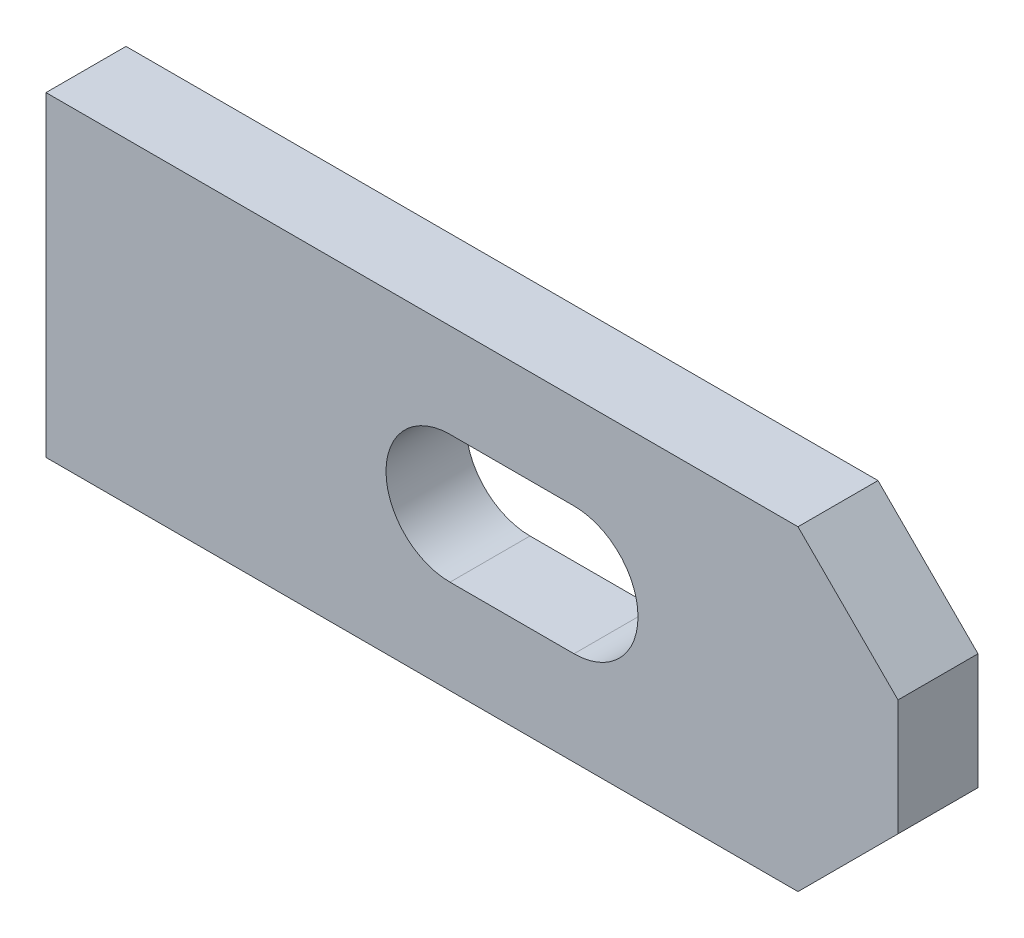
ISO-10303-21;
HEADER;
FILE_DESCRIPTION(('STEP AP214'),'2;1');
FILE_NAME('part.step','',(''),(''),'','','');
FILE_SCHEMA(('AUTOMOTIVE_DESIGN { 1 0 10303 214 1 1 1 1 }'));
ENDSEC;
DATA;
#1=APPLICATION_CONTEXT('core data for automotive mechanical design processes');
#2=APPLICATION_PROTOCOL_DEFINITION('international standard','automotive_design',2000,#1);
#3=PRODUCT_CONTEXT('',#1,'mechanical');
#4=PRODUCT('Part','Part','',(#3));
#5=PRODUCT_RELATED_PRODUCT_CATEGORY('part','',(#4));
#6=PRODUCT_DEFINITION_FORMATION('','',#4);
#7=PRODUCT_DEFINITION_CONTEXT('part definition',#1,'design');
#8=PRODUCT_DEFINITION('design','',#6,#7);
#9=PRODUCT_DEFINITION_SHAPE('','',#8);
#10=(LENGTH_UNIT() NAMED_UNIT(*) SI_UNIT(.MILLI.,.METRE.));
#11=(NAMED_UNIT(*) PLANE_ANGLE_UNIT() SI_UNIT($,.RADIAN.));
#12=(NAMED_UNIT(*) SI_UNIT($,.STERADIAN.) SOLID_ANGLE_UNIT());
#13=UNCERTAINTY_MEASURE_WITH_UNIT(LENGTH_MEASURE(1.E-05),#10,'distance_accuracy_value','');
#14=(GEOMETRIC_REPRESENTATION_CONTEXT(3) GLOBAL_UNCERTAINTY_ASSIGNED_CONTEXT((#13)) GLOBAL_UNIT_ASSIGNED_CONTEXT((#10,
#11,#12)) REPRESENTATION_CONTEXT('',''));
#15=CARTESIAN_POINT('',(0.,0.,0.));
#16=DIRECTION('',(0.,0.,1.));
#17=DIRECTION('',(1.,0.,0.));
#18=AXIS2_PLACEMENT_3D('',#15,#16,#17);
#19=CARTESIAN_POINT('',(0.,1.0033,0.254));
#20=DIRECTION('',(1.,0.,0.));
#21=DIRECTION('',(0.,0.,-1.));
#22=AXIS2_PLACEMENT_3D('',#19,#20,#21);
#23=PLANE('',#22);
#24=DIRECTION('',(0.,-1.,0.));
#25=VECTOR('',#24,1.);
#26=CARTESIAN_POINT('',(0.,1.0033,-0.254));
#27=LINE('',#26,#25);
#28=CARTESIAN_POINT('',(0.,1.0033,-0.254));
#29=VERTEX_POINT('',#28);
#30=CARTESIAN_POINT('',(0.,-1.0033,-0.254));
#31=VERTEX_POINT('',#30);
#32=EDGE_CURVE('E11',#29,#31,#27,.T.);
#33=ORIENTED_EDGE('',*,*,#32,.T.);
#34=DIRECTION('',(0.,0.,-1.));
#35=VECTOR('',#34,1.);
#36=CARTESIAN_POINT('',(0.,-1.0033,0.254));
#37=LINE('',#36,#35);
#38=CARTESIAN_POINT('',(0.,-1.0033,0.254));
#39=VERTEX_POINT('',#38);
#40=EDGE_CURVE('E25',#39,#31,#37,.T.);
#41=ORIENTED_EDGE('',*,*,#40,.F.);
#42=DIRECTION('',(0.,-1.,0.));
#43=VECTOR('',#42,1.);
#44=CARTESIAN_POINT('',(0.,1.0033,0.254));
#45=LINE('',#44,#43);
#46=CARTESIAN_POINT('',(0.,1.0033,0.254));
#47=VERTEX_POINT('',#46);
#48=EDGE_CURVE('E224',#47,#39,#45,.T.);
#49=ORIENTED_EDGE('',*,*,#48,.F.);
#50=DIRECTION('',(0.,0.,-1.));
#51=VECTOR('',#50,1.);
#52=CARTESIAN_POINT('',(0.,1.0033,0.254));
#53=LINE('',#52,#51);
#54=EDGE_CURVE('E220',#47,#29,#53,.T.);
#55=ORIENTED_EDGE('',*,*,#54,.T.);
#56=EDGE_LOOP('',(#33,#41,#49,#55));
#57=FACE_BOUND('',#56,.T.);
#58=ADVANCED_FACE('F17',(#57),#23,.F.);
#59=CARTESIAN_POINT('',(4.7752,1.0033,0.254));
#60=DIRECTION('',(0.,-1.,0.));
#61=DIRECTION('',(0.,0.,-1.));
#62=AXIS2_PLACEMENT_3D('',#59,#60,#61);
#63=PLANE('',#62);
#64=DIRECTION('',(-1.,0.,0.));
#65=VECTOR('',#64,1.);
#66=CARTESIAN_POINT('',(4.7752,1.0033,-0.254));
#67=LINE('',#66,#65);
#68=CARTESIAN_POINT('',(4.7752,1.0033,-0.254));
#69=VERTEX_POINT('',#68);
#70=EDGE_CURVE('E215',#69,#29,#67,.T.);
#71=ORIENTED_EDGE('',*,*,#70,.T.);
#72=ORIENTED_EDGE('',*,*,#54,.F.);
#73=DIRECTION('',(-1.,0.,0.));
#74=VECTOR('',#73,1.);
#75=CARTESIAN_POINT('',(4.7752,1.0033,0.254));
#76=LINE('',#75,#74);
#77=CARTESIAN_POINT('',(4.7752,1.0033,0.254));
#78=VERTEX_POINT('',#77);
#79=EDGE_CURVE('E210',#78,#47,#76,.T.);
#80=ORIENTED_EDGE('',*,*,#79,.F.);
#81=DIRECTION('',(0.,0.,-1.));
#82=VECTOR('',#81,1.);
#83=CARTESIAN_POINT('',(4.7752,1.0033,0.254));
#84=LINE('',#83,#82);
#85=EDGE_CURVE('E206',#78,#69,#84,.T.);
#86=ORIENTED_EDGE('',*,*,#85,.T.);
#87=EDGE_LOOP('',(#71,#72,#80,#86));
#88=FACE_BOUND('',#87,.T.);
#89=ADVANCED_FACE('F242',(#88),#63,.F.);
#90=CARTESIAN_POINT('',(5.4102,0.3683,0.254));
#91=DIRECTION('',(-0.707106781186548,-0.707106781186548,0.));
#92=DIRECTION('',(0.707106781186548,-0.707106781186548,0.));
#93=AXIS2_PLACEMENT_3D('',#90,#91,#92);
#94=PLANE('',#93);
#95=DIRECTION('',(-0.707106781186548,0.707106781186548,0.));
#96=VECTOR('',#95,1.);
#97=CARTESIAN_POINT('',(5.4102,0.3683,-0.254));
#98=LINE('',#97,#96);
#99=CARTESIAN_POINT('',(5.4102,0.3683,-0.254));
#100=VERTEX_POINT('',#99);
#101=EDGE_CURVE('E201',#100,#69,#98,.T.);
#102=ORIENTED_EDGE('',*,*,#101,.T.);
#103=ORIENTED_EDGE('',*,*,#85,.F.);
#104=DIRECTION('',(-0.707106781186548,0.707106781186548,0.));
#105=VECTOR('',#104,1.);
#106=CARTESIAN_POINT('',(5.4102,0.3683,0.254));
#107=LINE('',#106,#105);
#108=CARTESIAN_POINT('',(5.4102,0.3683,0.254));
#109=VERTEX_POINT('',#108);
#110=EDGE_CURVE('E196',#109,#78,#107,.T.);
#111=ORIENTED_EDGE('',*,*,#110,.F.);
#112=DIRECTION('',(0.,0.,-1.));
#113=VECTOR('',#112,1.);
#114=CARTESIAN_POINT('',(5.4102,0.3683,0.254));
#115=LINE('',#114,#113);
#116=EDGE_CURVE('E192',#109,#100,#115,.T.);
#117=ORIENTED_EDGE('',*,*,#116,.T.);
#118=EDGE_LOOP('',(#102,#103,#111,#117));
#119=FACE_BOUND('',#118,.T.);
#120=ADVANCED_FACE('F253',(#119),#94,.F.);
#121=CARTESIAN_POINT('',(5.4102,-0.3683,0.254));
#122=DIRECTION('',(-1.,0.,0.));
#123=DIRECTION('',(0.,0.,1.));
#124=AXIS2_PLACEMENT_3D('',#121,#122,#123);
#125=PLANE('',#124);
#126=DIRECTION('',(0.,1.,0.));
#127=VECTOR('',#126,1.);
#128=CARTESIAN_POINT('',(5.4102,-0.3683,-0.254));
#129=LINE('',#128,#127);
#130=CARTESIAN_POINT('',(5.4102,-0.3683,-0.254));
#131=VERTEX_POINT('',#130);
#132=EDGE_CURVE('E187',#131,#100,#129,.T.);
#133=ORIENTED_EDGE('',*,*,#132,.T.);
#134=ORIENTED_EDGE('',*,*,#116,.F.);
#135=DIRECTION('',(0.,1.,0.));
#136=VECTOR('',#135,1.);
#137=CARTESIAN_POINT('',(5.4102,-0.3683,0.254));
#138=LINE('',#137,#136);
#139=CARTESIAN_POINT('',(5.4102,-0.3683,0.254));
#140=VERTEX_POINT('',#139);
#141=EDGE_CURVE('E182',#140,#109,#138,.T.);
#142=ORIENTED_EDGE('',*,*,#141,.F.);
#143=DIRECTION('',(0.,0.,-1.));
#144=VECTOR('',#143,1.);
#145=CARTESIAN_POINT('',(5.4102,-0.3683,0.254));
#146=LINE('',#145,#144);
#147=EDGE_CURVE('E178',#140,#131,#146,.T.);
#148=ORIENTED_EDGE('',*,*,#147,.T.);
#149=EDGE_LOOP('',(#133,#134,#142,#148));
#150=FACE_BOUND('',#149,.T.);
#151=ADVANCED_FACE('F251',(#150),#125,.F.);
#152=CARTESIAN_POINT('',(4.7752,-1.0033,0.254));
#153=DIRECTION('',(-0.707106781186548,0.707106781186548,0.));
#154=DIRECTION('',(-0.707106781186548,-0.707106781186548,0.));
#155=AXIS2_PLACEMENT_3D('',#152,#153,#154);
#156=PLANE('',#155);
#157=DIRECTION('',(0.707106781186548,0.707106781186548,0.));
#158=VECTOR('',#157,1.);
#159=CARTESIAN_POINT('',(4.7752,-1.0033,-0.254));
#160=LINE('',#159,#158);
#161=CARTESIAN_POINT('',(4.7752,-1.0033,-0.254));
#162=VERTEX_POINT('',#161);
#163=EDGE_CURVE('E173',#162,#131,#160,.T.);
#164=ORIENTED_EDGE('',*,*,#163,.T.);
#165=ORIENTED_EDGE('',*,*,#147,.F.);
#166=DIRECTION('',(0.707106781186548,0.707106781186548,0.));
#167=VECTOR('',#166,1.);
#168=CARTESIAN_POINT('',(4.7752,-1.0033,0.254));
#169=LINE('',#168,#167);
#170=CARTESIAN_POINT('',(4.7752,-1.0033,0.254));
#171=VERTEX_POINT('',#170);
#172=EDGE_CURVE('E168',#171,#140,#169,.T.);
#173=ORIENTED_EDGE('',*,*,#172,.F.);
#174=DIRECTION('',(0.,0.,-1.));
#175=VECTOR('',#174,1.);
#176=CARTESIAN_POINT('',(4.7752,-1.0033,0.254));
#177=LINE('',#176,#175);
#178=EDGE_CURVE('E164',#171,#162,#177,.T.);
#179=ORIENTED_EDGE('',*,*,#178,.T.);
#180=EDGE_LOOP('',(#164,#165,#173,#179));
#181=FACE_BOUND('',#180,.T.);
#182=ADVANCED_FACE('F248',(#181),#156,.F.);
#183=CARTESIAN_POINT('',(0.,-1.0033,0.254));
#184=DIRECTION('',(0.,1.,0.));
#185=DIRECTION('',(0.,0.,1.));
#186=AXIS2_PLACEMENT_3D('',#183,#184,#185);
#187=PLANE('',#186);
#188=DIRECTION('',(1.,0.,0.));
#189=VECTOR('',#188,1.);
#190=CARTESIAN_POINT('',(0.,-1.0033,-0.254));
#191=LINE('',#190,#189);
#192=EDGE_CURVE('E159',#31,#162,#191,.T.);
#193=ORIENTED_EDGE('',*,*,#192,.T.);
#194=ORIENTED_EDGE('',*,*,#178,.F.);
#195=DIRECTION('',(1.,0.,0.));
#196=VECTOR('',#195,1.);
#197=CARTESIAN_POINT('',(0.,-1.0033,0.254));
#198=LINE('',#197,#196);
#199=EDGE_CURVE('E154',#39,#171,#198,.T.);
#200=ORIENTED_EDGE('',*,*,#199,.F.);
#201=ORIENTED_EDGE('',*,*,#40,.T.);
#202=EDGE_LOOP('',(#193,#194,#200,#201));
#203=FACE_BOUND('',#202,.T.);
#204=ADVANCED_FACE('F234',(#203),#187,.F.);
#205=CARTESIAN_POINT('',(0.,0.,0.254));
#206=DIRECTION('',(0.,0.,1.));
#207=DIRECTION('',(1.,0.,0.));
#208=AXIS2_PLACEMENT_3D('',#205,#206,#207);
#209=PLANE('',#208);
#210=DIRECTION('',(-1.,0.,0.));
#211=VECTOR('',#210,1.);
#212=CARTESIAN_POINT('',(3.3528,0.4064,0.254));
#213=LINE('',#212,#211);
#214=CARTESIAN_POINT('',(3.3528,0.4064,0.254));
#215=VERTEX_POINT('',#214);
#216=CARTESIAN_POINT('',(2.5654,0.4064,0.254));
#217=VERTEX_POINT('',#216);
#218=EDGE_CURVE('E150',#215,#217,#213,.T.);
#219=ORIENTED_EDGE('',*,*,#218,.F.);
#220=CARTESIAN_POINT('',(3.3528,0.,0.254));
#221=DIRECTION('',(0.,0.,1.));
#222=DIRECTION('',(1.,0.,0.));
#223=AXIS2_PLACEMENT_3D('',#220,#221,#222);
#224=CIRCLE('',#223,0.4064);
#225=CARTESIAN_POINT('',(3.3528,-0.4064,0.254));
#226=VERTEX_POINT('',#225);
#227=EDGE_CURVE('E98',#226,#215,#224,.T.);
#228=ORIENTED_EDGE('',*,*,#227,.F.);
#229=DIRECTION('',(1.,0.,0.));
#230=VECTOR('',#229,1.);
#231=CARTESIAN_POINT('',(2.5654,-0.4064,0.254));
#232=LINE('',#231,#230);
#233=CARTESIAN_POINT('',(2.5654,-0.4064,0.254));
#234=VERTEX_POINT('',#233);
#235=EDGE_CURVE('E142',#234,#226,#232,.T.);
#236=ORIENTED_EDGE('',*,*,#235,.F.);
#237=CARTESIAN_POINT('',(2.5654,0.,0.254));
#238=DIRECTION('',(0.,0.,1.));
#239=DIRECTION('',(1.,0.,0.));
#240=AXIS2_PLACEMENT_3D('',#237,#238,#239);
#241=CIRCLE('',#240,0.4064);
#242=EDGE_CURVE('E137',#217,#234,#241,.T.);
#243=ORIENTED_EDGE('',*,*,#242,.F.);
#244=EDGE_LOOP('',(#219,#228,#236,#243));
#245=FACE_BOUND('',#244,.T.);
#246=ORIENTED_EDGE('',*,*,#48,.T.);
#247=ORIENTED_EDGE('',*,*,#199,.T.);
#248=ORIENTED_EDGE('',*,*,#172,.T.);
#249=ORIENTED_EDGE('',*,*,#141,.T.);
#250=ORIENTED_EDGE('',*,*,#110,.T.);
#251=ORIENTED_EDGE('',*,*,#79,.T.);
#252=EDGE_LOOP('',(#246,#247,#248,#249,#250,#251));
#253=FACE_BOUND('',#252,.T.);
#254=ADVANCED_FACE('F238',(#245,#253),#209,.T.);
#255=CARTESIAN_POINT('',(2.5654,0.,0.254));
#256=DIRECTION('',(0.,0.,-1.));
#257=DIRECTION('',(1.,0.,0.));
#258=AXIS2_PLACEMENT_3D('',#255,#256,#257);
#259=CYLINDRICAL_SURFACE('',#258,0.4064);
#260=CARTESIAN_POINT('',(2.5654,0.,-0.254));
#261=DIRECTION('',(0.,0.,1.));
#262=DIRECTION('',(1.,0.,0.));
#263=AXIS2_PLACEMENT_3D('',#260,#261,#262);
#264=CIRCLE('',#263,0.4064);
#265=CARTESIAN_POINT('',(2.5654,0.4064,-0.254));
#266=VERTEX_POINT('',#265);
#267=CARTESIAN_POINT('',(2.5654,-0.4064,-0.254));
#268=VERTEX_POINT('',#267);
#269=EDGE_CURVE('E133',#266,#268,#264,.T.);
#270=ORIENTED_EDGE('',*,*,#269,.F.);
#271=DIRECTION('',(0.,0.,-1.));
#272=VECTOR('',#271,1.);
#273=CARTESIAN_POINT('',(2.5654,0.4064,0.254));
#274=LINE('',#273,#272);
#275=EDGE_CURVE('E107',#217,#266,#274,.T.);
#276=ORIENTED_EDGE('',*,*,#275,.F.);
#277=ORIENTED_EDGE('',*,*,#242,.T.);
#278=DIRECTION('',(0.,0.,-1.));
#279=VECTOR('',#278,1.);
#280=CARTESIAN_POINT('',(2.5654,-0.4064,0.254));
#281=LINE('',#280,#279);
#282=EDGE_CURVE('E126',#234,#268,#281,.T.);
#283=ORIENTED_EDGE('',*,*,#282,.T.);
#284=EDGE_LOOP('',(#270,#276,#277,#283));
#285=FACE_BOUND('',#284,.T.);
#286=ADVANCED_FACE('F314',(#285),#259,.F.);
#287=CARTESIAN_POINT('',(2.5654,-0.4064,0.254));
#288=DIRECTION('',(0.,1.,0.));
#289=DIRECTION('',(0.,0.,1.));
#290=AXIS2_PLACEMENT_3D('',#287,#288,#289);
#291=PLANE('',#290);
#292=DIRECTION('',(1.,0.,0.));
#293=VECTOR('',#292,1.);
#294=CARTESIAN_POINT('',(2.5654,-0.4064,-0.254));
#295=LINE('',#294,#293);
#296=CARTESIAN_POINT('',(3.3528,-0.4064,-0.254));
#297=VERTEX_POINT('',#296);
#298=EDGE_CURVE('E114',#268,#297,#295,.T.);
#299=ORIENTED_EDGE('',*,*,#298,.F.);
#300=ORIENTED_EDGE('',*,*,#282,.F.);
#301=ORIENTED_EDGE('',*,*,#235,.T.);
#302=DIRECTION('',(0.,0.,-1.));
#303=VECTOR('',#302,1.);
#304=CARTESIAN_POINT('',(3.3528,-0.4064,0.254));
#305=LINE('',#304,#303);
#306=EDGE_CURVE('E115',#226,#297,#305,.T.);
#307=ORIENTED_EDGE('',*,*,#306,.T.);
#308=EDGE_LOOP('',(#299,#300,#301,#307));
#309=FACE_BOUND('',#308,.T.);
#310=ADVANCED_FACE('F325',(#309),#291,.T.);
#311=CARTESIAN_POINT('',(3.3528,0.,0.254));
#312=DIRECTION('',(0.,0.,-1.));
#313=DIRECTION('',(-1.,0.,0.));
#314=AXIS2_PLACEMENT_3D('',#311,#312,#313);
#315=CYLINDRICAL_SURFACE('',#314,0.4064);
#316=CARTESIAN_POINT('',(3.3528,0.,-0.254));
#317=DIRECTION('',(0.,0.,1.));
#318=DIRECTION('',(1.,0.,0.));
#319=AXIS2_PLACEMENT_3D('',#316,#317,#318);
#320=CIRCLE('',#319,0.4064);
#321=CARTESIAN_POINT('',(3.3528,0.4064,-0.254));
#322=VERTEX_POINT('',#321);
#323=EDGE_CURVE('E96',#297,#322,#320,.T.);
#324=ORIENTED_EDGE('',*,*,#323,.F.);
#325=ORIENTED_EDGE('',*,*,#306,.F.);
#326=ORIENTED_EDGE('',*,*,#227,.T.);
#327=DIRECTION('',(0.,0.,-1.));
#328=VECTOR('',#327,1.);
#329=CARTESIAN_POINT('',(3.3528,0.4064,0.254));
#330=LINE('',#329,#328);
#331=EDGE_CURVE('E91',#215,#322,#330,.T.);
#332=ORIENTED_EDGE('',*,*,#331,.T.);
#333=EDGE_LOOP('',(#324,#325,#326,#332));
#334=FACE_BOUND('',#333,.T.);
#335=ADVANCED_FACE('F93',(#334),#315,.F.);
#336=CARTESIAN_POINT('',(3.3528,0.4064,0.254));
#337=DIRECTION('',(0.,-1.,0.));
#338=DIRECTION('',(0.,0.,-1.));
#339=AXIS2_PLACEMENT_3D('',#336,#337,#338);
#340=PLANE('',#339);
#341=DIRECTION('',(-1.,0.,0.));
#342=VECTOR('',#341,1.);
#343=CARTESIAN_POINT('',(3.3528,0.4064,-0.254));
#344=LINE('',#343,#342);
#345=EDGE_CURVE('E101',#322,#266,#344,.T.);
#346=ORIENTED_EDGE('',*,*,#345,.F.);
#347=ORIENTED_EDGE('',*,*,#331,.F.);
#348=ORIENTED_EDGE('',*,*,#218,.T.);
#349=ORIENTED_EDGE('',*,*,#275,.T.);
#350=EDGE_LOOP('',(#346,#347,#348,#349));
#351=FACE_BOUND('',#350,.T.);
#352=ADVANCED_FACE('F105',(#351),#340,.T.);
#353=CARTESIAN_POINT('',(0.,0.,-0.254));
#354=DIRECTION('',(0.,0.,1.));
#355=DIRECTION('',(1.,0.,0.));
#356=AXIS2_PLACEMENT_3D('',#353,#354,#355);
#357=PLANE('',#356);
#358=ORIENTED_EDGE('',*,*,#345,.T.);
#359=ORIENTED_EDGE('',*,*,#269,.T.);
#360=ORIENTED_EDGE('',*,*,#298,.T.);
#361=ORIENTED_EDGE('',*,*,#323,.T.);
#362=EDGE_LOOP('',(#358,#359,#360,#361));
#363=FACE_BOUND('',#362,.T.);
#364=ORIENTED_EDGE('',*,*,#32,.F.);
#365=ORIENTED_EDGE('',*,*,#70,.F.);
#366=ORIENTED_EDGE('',*,*,#101,.F.);
#367=ORIENTED_EDGE('',*,*,#132,.F.);
#368=ORIENTED_EDGE('',*,*,#163,.F.);
#369=ORIENTED_EDGE('',*,*,#192,.F.);
#370=EDGE_LOOP('',(#364,#365,#366,#367,#368,#369));
#371=FACE_BOUND('',#370,.T.);
#372=ADVANCED_FACE('F111',(#363,#371),#357,.F.);
#373=CLOSED_SHELL('',(#58,#89,#120,#151,#182,#204,#254,#286,#310,#335,#352,#372));
#374=MANIFOLD_SOLID_BREP('B1',#373);
#375=ADVANCED_BREP_SHAPE_REPRESENTATION('',(#18,#374),#14);
#376=SHAPE_DEFINITION_REPRESENTATION(#9,#375);
ENDSEC;
END-ISO-10303-21;
